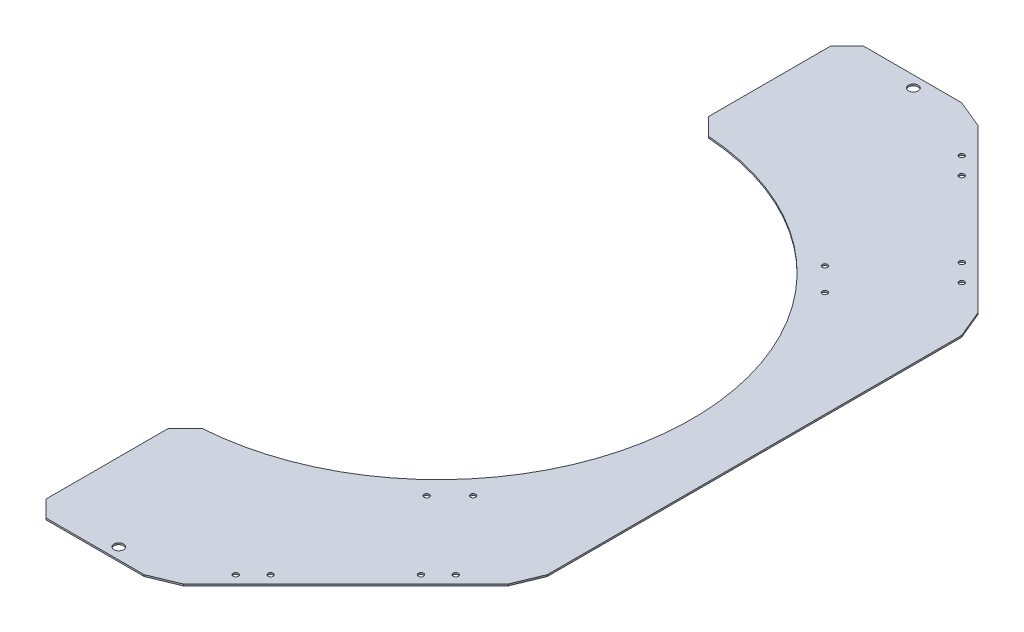
ISO-10303-21;
HEADER;
FILE_DESCRIPTION(('STEP AP214'),'2;1');
FILE_NAME('part.step','',(''),(''),'','','');
FILE_SCHEMA(('AUTOMOTIVE_DESIGN { 1 0 10303 214 1 1 1 1 }'));
ENDSEC;
DATA;
#1=APPLICATION_CONTEXT('core data for automotive mechanical design processes');
#2=APPLICATION_PROTOCOL_DEFINITION('international standard','automotive_design',2000,#1);
#3=PRODUCT_CONTEXT('',#1,'mechanical');
#4=PRODUCT('Part','Part','',(#3));
#5=PRODUCT_RELATED_PRODUCT_CATEGORY('part','',(#4));
#6=PRODUCT_DEFINITION_FORMATION('','',#4);
#7=PRODUCT_DEFINITION_CONTEXT('part definition',#1,'design');
#8=PRODUCT_DEFINITION('design','',#6,#7);
#9=PRODUCT_DEFINITION_SHAPE('','',#8);
#10=(LENGTH_UNIT() NAMED_UNIT(*) SI_UNIT(.MILLI.,.METRE.));
#11=(NAMED_UNIT(*) PLANE_ANGLE_UNIT() SI_UNIT($,.RADIAN.));
#12=(NAMED_UNIT(*) SI_UNIT($,.STERADIAN.) SOLID_ANGLE_UNIT());
#13=UNCERTAINTY_MEASURE_WITH_UNIT(LENGTH_MEASURE(1.E-05),#10,'distance_accuracy_value','');
#14=(GEOMETRIC_REPRESENTATION_CONTEXT(3) GLOBAL_UNCERTAINTY_ASSIGNED_CONTEXT((#13)) GLOBAL_UNIT_ASSIGNED_CONTEXT((#10,
#11,#12)) REPRESENTATION_CONTEXT('',''));
#15=CARTESIAN_POINT('',(0.,0.,0.));
#16=DIRECTION('',(0.,0.,1.));
#17=DIRECTION('',(1.,0.,0.));
#18=AXIS2_PLACEMENT_3D('',#15,#16,#17);
#19=CARTESIAN_POINT('',(0.,1.,0.));
#20=DIRECTION('',(0.,-1.,0.));
#21=DIRECTION('',(0.,0.,-1.));
#22=AXIS2_PLACEMENT_3D('',#19,#20,#21);
#23=CYLINDRICAL_SURFACE('',#22,155.);
#24=CARTESIAN_POINT('',(0.,0.,0.));
#25=DIRECTION('',(0.,1.,0.));
#26=DIRECTION('',(0.,0.,1.));
#27=AXIS2_PLACEMENT_3D('',#24,#25,#26);
#28=CIRCLE('',#27,155.);
#29=CARTESIAN_POINT('',(10.345651551691,0.,154.654348448309));
#30=VERTEX_POINT('',#29);
#31=CARTESIAN_POINT('',(10.3456515516909,0.,-154.654348448309));
#32=VERTEX_POINT('',#31);
#33=EDGE_CURVE('E203',#30,#32,#28,.T.);
#34=ORIENTED_EDGE('',*,*,#33,.F.);
#35=DIRECTION('',(0.,-1.,0.));
#36=VECTOR('',#35,1.);
#37=CARTESIAN_POINT('',(10.345651551691,1.,154.654348448309));
#38=LINE('',#37,#36);
#39=CARTESIAN_POINT('',(10.345651551691,1.,154.654348448309));
#40=VERTEX_POINT('',#39);
#41=EDGE_CURVE('E269',#30,#40,#38,.F.);
#42=ORIENTED_EDGE('',*,*,#41,.T.);
#43=CARTESIAN_POINT('',(0.,1.,0.));
#44=DIRECTION('',(0.,1.,0.));
#45=DIRECTION('',(0.,0.,1.));
#46=AXIS2_PLACEMENT_3D('',#43,#44,#45);
#47=CIRCLE('',#46,155.);
#48=CARTESIAN_POINT('',(10.3456515516909,1.,-154.654348448309));
#49=VERTEX_POINT('',#48);
#50=EDGE_CURVE('E221',#40,#49,#47,.T.);
#51=ORIENTED_EDGE('',*,*,#50,.T.);
#52=DIRECTION('',(0.,-1.,0.));
#53=VECTOR('',#52,1.);
#54=CARTESIAN_POINT('',(10.3456515516909,1.,-154.654348448309));
#55=LINE('',#54,#53);
#56=EDGE_CURVE('E263',#49,#32,#55,.T.);
#57=ORIENTED_EDGE('',*,*,#56,.T.);
#58=EDGE_LOOP('',(#34,#42,#51,#57));
#59=FACE_BOUND('',#58,.T.);
#60=ADVANCED_FACE('F43',(#59),#23,.F.);
#61=CARTESIAN_POINT('',(0.,1.,0.));
#62=DIRECTION('',(-1.,0.,0.));
#63=DIRECTION('',(0.,0.,1.));
#64=AXIS2_PLACEMENT_3D('',#61,#62,#63);
#65=PLANE('',#64);
#66=DIRECTION('',(0.,0.,-1.));
#67=VECTOR('',#66,1.);
#68=CARTESIAN_POINT('',(0.,1.,0.));
#69=LINE('',#68,#67);
#70=CARTESIAN_POINT('',(0.,1.,239.705627484771));
#71=VERTEX_POINT('',#70);
#72=CARTESIAN_POINT('',(0.,1.,165.));
#73=VERTEX_POINT('',#72);
#74=EDGE_CURVE('E194',#71,#73,#69,.T.);
#75=ORIENTED_EDGE('',*,*,#74,.T.);
#76=DIRECTION('',(0.,-1.,0.));
#77=VECTOR('',#76,1.);
#78=CARTESIAN_POINT('',(0.,1.,165.));
#79=LINE('',#78,#77);
#80=CARTESIAN_POINT('',(0.,0.,165.));
#81=VERTEX_POINT('',#80);
#82=EDGE_CURVE('E259',#73,#81,#79,.T.);
#83=ORIENTED_EDGE('',*,*,#82,.T.);
#84=DIRECTION('',(0.,0.,-1.));
#85=VECTOR('',#84,1.);
#86=CARTESIAN_POINT('',(0.,0.,0.));
#87=LINE('',#86,#85);
#88=CARTESIAN_POINT('',(0.,0.,239.705627484771));
#89=VERTEX_POINT('',#88);
#90=EDGE_CURVE('E210',#89,#81,#87,.T.);
#91=ORIENTED_EDGE('',*,*,#90,.F.);
#92=DIRECTION('',(0.,1.,0.));
#93=VECTOR('',#92,1.);
#94=CARTESIAN_POINT('',(0.,1.,239.705627484771));
#95=LINE('',#94,#93);
#96=EDGE_CURVE('E257',#89,#71,#95,.T.);
#97=ORIENTED_EDGE('',*,*,#96,.T.);
#98=EDGE_LOOP('',(#75,#83,#91,#97));
#99=FACE_BOUND('',#98,.T.);
#100=ADVANCED_FACE('F364',(#99),#65,.T.);
#101=CARTESIAN_POINT('',(0.,1.,249.705627484771));
#102=DIRECTION('',(0.,0.,1.));
#103=DIRECTION('',(1.,0.,0.));
#104=AXIS2_PLACEMENT_3D('',#101,#102,#103);
#105=PLANE('',#104);
#106=DIRECTION('',(-1.,0.,0.));
#107=VECTOR('',#106,1.);
#108=CARTESIAN_POINT('',(0.,0.,249.705627484771));
#109=LINE('',#108,#107);
#110=CARTESIAN_POINT('',(70.,0.,249.705627484771));
#111=VERTEX_POINT('',#110);
#112=CARTESIAN_POINT('',(9.99999999999995,0.,249.705627484771));
#113=VERTEX_POINT('',#112);
#114=EDGE_CURVE('E211',#111,#113,#109,.T.);
#115=ORIENTED_EDGE('',*,*,#114,.F.);
#116=DIRECTION('',(0.,1.,0.));
#117=VECTOR('',#116,1.);
#118=CARTESIAN_POINT('',(70.,1.,249.705627484771));
#119=LINE('',#118,#117);
#120=CARTESIAN_POINT('',(70.,1.,249.705627484771));
#121=VERTEX_POINT('',#120);
#122=EDGE_CURVE('E256',#111,#121,#119,.T.);
#123=ORIENTED_EDGE('',*,*,#122,.T.);
#124=DIRECTION('',(-1.,0.,0.));
#125=VECTOR('',#124,1.);
#126=CARTESIAN_POINT('',(0.,1.,249.705627484771));
#127=LINE('',#126,#125);
#128=CARTESIAN_POINT('',(9.99999999999995,1.,249.705627484771));
#129=VERTEX_POINT('',#128);
#130=EDGE_CURVE('E186',#121,#129,#127,.T.);
#131=ORIENTED_EDGE('',*,*,#130,.T.);
#132=DIRECTION('',(0.,-1.,0.));
#133=VECTOR('',#132,1.);
#134=CARTESIAN_POINT('',(9.99999999999995,1.,249.705627484771));
#135=LINE('',#134,#133);
#136=EDGE_CURVE('E254',#129,#113,#135,.T.);
#137=ORIENTED_EDGE('',*,*,#136,.T.);
#138=EDGE_LOOP('',(#115,#123,#131,#137));
#139=FACE_BOUND('',#138,.T.);
#140=ADVANCED_FACE('F425',(#139),#105,.T.);
#141=CARTESIAN_POINT('',(164.852813742386,1.,164.852813742386));
#142=DIRECTION('',(0.707106781186548,0.,0.707106781186547));
#143=DIRECTION('',(0.707106781186547,0.,-0.707106781186548));
#144=AXIS2_PLACEMENT_3D('',#141,#142,#143);
#145=PLANE('',#144);
#146=DIRECTION('',(-0.707106781186547,0.,0.707106781186548));
#147=VECTOR('',#146,1.);
#148=CARTESIAN_POINT('',(164.852813742386,0.,164.852813742386));
#149=LINE('',#148,#147);
#150=CARTESIAN_POINT('',(186.066017177982,0.,143.639610306789));
#151=VERTEX_POINT('',#150);
#152=CARTESIAN_POINT('',(87.0710678118655,0.,242.634559672906));
#153=VERTEX_POINT('',#152);
#154=EDGE_CURVE('E181',#151,#153,#149,.T.);
#155=ORIENTED_EDGE('',*,*,#154,.F.);
#156=DIRECTION('',(0.,1.,0.));
#157=VECTOR('',#156,1.);
#158=CARTESIAN_POINT('',(186.066017177982,1.,143.639610306789));
#159=LINE('',#158,#157);
#160=CARTESIAN_POINT('',(186.066017177982,1.,143.639610306789));
#161=VERTEX_POINT('',#160);
#162=EDGE_CURVE('E165',#151,#161,#159,.T.);
#163=ORIENTED_EDGE('',*,*,#162,.T.);
#164=DIRECTION('',(-0.707106781186547,0.,0.707106781186548));
#165=VECTOR('',#164,1.);
#166=CARTESIAN_POINT('',(164.852813742386,1.,164.852813742386));
#167=LINE('',#166,#165);
#168=CARTESIAN_POINT('',(87.0710678118655,1.,242.634559672906));
#169=VERTEX_POINT('',#168);
#170=EDGE_CURVE('E178',#161,#169,#167,.T.);
#171=ORIENTED_EDGE('',*,*,#170,.T.);
#172=DIRECTION('',(0.,-1.,0.));
#173=VECTOR('',#172,1.);
#174=CARTESIAN_POINT('',(87.0710678118655,1.,242.634559672906));
#175=LINE('',#174,#173);
#176=EDGE_CURVE('E182',#169,#153,#175,.T.);
#177=ORIENTED_EDGE('',*,*,#176,.T.);
#178=EDGE_LOOP('',(#155,#163,#171,#177));
#179=FACE_BOUND('',#178,.T.);
#180=ADVANCED_FACE('F176',(#179),#145,.T.);
#181=CARTESIAN_POINT('',(164.852813742386,1.,-164.852813742386));
#182=DIRECTION('',(0.707106781186547,0.,-0.707106781186547));
#183=DIRECTION('',(-0.707106781186548,0.,-0.707106781186548));
#184=AXIS2_PLACEMENT_3D('',#181,#182,#183);
#185=PLANE('',#184);
#186=DIRECTION('',(0.707106781186548,0.,0.707106781186548));
#187=VECTOR('',#186,1.);
#188=CARTESIAN_POINT('',(164.852813742386,0.,-164.852813742386));
#189=LINE('',#188,#187);
#190=CARTESIAN_POINT('',(87.0710678118655,0.,-242.634559672906));
#191=VERTEX_POINT('',#190);
#192=CARTESIAN_POINT('',(186.066017177982,0.,-143.639610306789));
#193=VERTEX_POINT('',#192);
#194=EDGE_CURVE('E214',#191,#193,#189,.T.);
#195=ORIENTED_EDGE('',*,*,#194,.F.);
#196=DIRECTION('',(0.,1.,0.));
#197=VECTOR('',#196,1.);
#198=CARTESIAN_POINT('',(87.0710678118655,1.,-242.634559672906));
#199=LINE('',#198,#197);
#200=CARTESIAN_POINT('',(87.0710678118655,1.,-242.634559672906));
#201=VERTEX_POINT('',#200);
#202=EDGE_CURVE('E11',#191,#201,#199,.T.);
#203=ORIENTED_EDGE('',*,*,#202,.T.);
#204=DIRECTION('',(0.707106781186548,0.,0.707106781186548));
#205=VECTOR('',#204,1.);
#206=CARTESIAN_POINT('',(164.852813742386,1.,-164.852813742386));
#207=LINE('',#206,#205);
#208=CARTESIAN_POINT('',(186.066017177982,1.,-143.639610306789));
#209=VERTEX_POINT('',#208);
#210=EDGE_CURVE('E189',#201,#209,#207,.T.);
#211=ORIENTED_EDGE('',*,*,#210,.T.);
#212=DIRECTION('',(0.,-1.,0.));
#213=VECTOR('',#212,1.);
#214=CARTESIAN_POINT('',(186.066017177982,0.,-143.639610306789));
#215=LINE('',#214,#213);
#216=EDGE_CURVE('E52',#209,#193,#215,.T.);
#217=ORIENTED_EDGE('',*,*,#216,.T.);
#218=EDGE_LOOP('',(#195,#203,#211,#217));
#219=FACE_BOUND('',#218,.T.);
#220=ADVANCED_FACE('F398',(#219),#185,.T.);
#221=CARTESIAN_POINT('',(0.,1.,-249.705627484771));
#222=DIRECTION('',(0.,0.,-1.));
#223=DIRECTION('',(-1.,0.,0.));
#224=AXIS2_PLACEMENT_3D('',#221,#222,#223);
#225=PLANE('',#224);
#226=DIRECTION('',(1.,0.,0.));
#227=VECTOR('',#226,1.);
#228=CARTESIAN_POINT('',(0.,0.,-249.705627484771));
#229=LINE('',#228,#227);
#230=CARTESIAN_POINT('',(10.0000000000001,0.,-249.705627484771));
#231=VERTEX_POINT('',#230);
#232=CARTESIAN_POINT('',(69.9999999999999,0.,-249.705627484771));
#233=VERTEX_POINT('',#232);
#234=EDGE_CURVE('E218',#231,#233,#229,.T.);
#235=ORIENTED_EDGE('',*,*,#234,.F.);
#236=DIRECTION('',(0.,1.,0.));
#237=VECTOR('',#236,1.);
#238=CARTESIAN_POINT('',(10.0000000000001,1.,-249.705627484771));
#239=LINE('',#238,#237);
#240=CARTESIAN_POINT('',(10.0000000000001,1.,-249.705627484771));
#241=VERTEX_POINT('',#240);
#242=EDGE_CURVE('E273',#231,#241,#239,.T.);
#243=ORIENTED_EDGE('',*,*,#242,.T.);
#244=DIRECTION('',(1.,0.,0.));
#245=VECTOR('',#244,1.);
#246=CARTESIAN_POINT('',(0.,1.,-249.705627484771));
#247=LINE('',#246,#245);
#248=CARTESIAN_POINT('',(69.9999999999999,1.,-249.705627484771));
#249=VERTEX_POINT('',#248);
#250=EDGE_CURVE('E195',#241,#249,#247,.T.);
#251=ORIENTED_EDGE('',*,*,#250,.T.);
#252=DIRECTION('',(0.,-1.,0.));
#253=VECTOR('',#252,1.);
#254=CARTESIAN_POINT('',(69.9999999999999,1.,-249.705627484771));
#255=LINE('',#254,#253);
#256=EDGE_CURVE('E271',#249,#233,#255,.T.);
#257=ORIENTED_EDGE('',*,*,#256,.T.);
#258=EDGE_LOOP('',(#235,#243,#251,#257));
#259=FACE_BOUND('',#258,.T.);
#260=ADVANCED_FACE('F395',(#259),#225,.T.);
#261=CARTESIAN_POINT('',(0.,1.,0.));
#262=DIRECTION('',(-1.,0.,0.));
#263=DIRECTION('',(0.,0.,1.));
#264=AXIS2_PLACEMENT_3D('',#261,#262,#263);
#265=PLANE('',#264);
#266=DIRECTION('',(0.,0.,-1.));
#267=VECTOR('',#266,1.);
#268=CARTESIAN_POINT('',(0.,0.,0.));
#269=LINE('',#268,#267);
#270=CARTESIAN_POINT('',(0.,0.,-165.));
#271=VERTEX_POINT('',#270);
#272=CARTESIAN_POINT('',(0.,0.,-239.705627484771));
#273=VERTEX_POINT('',#272);
#274=EDGE_CURVE('E216',#271,#273,#269,.T.);
#275=ORIENTED_EDGE('',*,*,#274,.F.);
#276=DIRECTION('',(0.,1.,0.));
#277=VECTOR('',#276,1.);
#278=CARTESIAN_POINT('',(0.,1.,-165.));
#279=LINE('',#278,#277);
#280=CARTESIAN_POINT('',(0.,1.,-165.));
#281=VERTEX_POINT('',#280);
#282=EDGE_CURVE('E272',#271,#281,#279,.T.);
#283=ORIENTED_EDGE('',*,*,#282,.T.);
#284=DIRECTION('',(0.,0.,-1.));
#285=VECTOR('',#284,1.);
#286=CARTESIAN_POINT('',(0.,1.,0.));
#287=LINE('',#286,#285);
#288=CARTESIAN_POINT('',(0.,1.,-239.705627484771));
#289=VERTEX_POINT('',#288);
#290=EDGE_CURVE('E204',#281,#289,#287,.T.);
#291=ORIENTED_EDGE('',*,*,#290,.T.);
#292=DIRECTION('',(0.,-1.,0.));
#293=VECTOR('',#292,1.);
#294=CARTESIAN_POINT('',(0.,1.,-239.705627484771));
#295=LINE('',#294,#293);
#296=EDGE_CURVE('E270',#289,#273,#295,.T.);
#297=ORIENTED_EDGE('',*,*,#296,.T.);
#298=EDGE_LOOP('',(#275,#283,#291,#297));
#299=FACE_BOUND('',#298,.T.);
#300=ADVANCED_FACE('F384',(#299),#265,.T.);
#301=CARTESIAN_POINT('',(0.,1.,0.));
#302=DIRECTION('',(0.,1.,0.));
#303=DIRECTION('',(0.,0.,1.));
#304=AXIS2_PLACEMENT_3D('',#301,#302,#303);
#305=PLANE('',#304);
#306=CARTESIAN_POINT('',(114.557611844575,1.,-121.62867965644));
#307=DIRECTION('',(0.,1.,0.));
#308=DIRECTION('',(0.,0.,1.));
#309=AXIS2_PLACEMENT_3D('',#306,#307,#308);
#310=CIRCLE('',#309,1.60000000000001);
#311=CARTESIAN_POINT('',(114.557611844575,1.,-120.02867965644));
#312=VERTEX_POINT('',#311);
#313=EDGE_CURVE('E317',#312,#312,#310,.T.);
#314=ORIENTED_EDGE('',*,*,#313,.F.);
#315=EDGE_LOOP('',(#314));
#316=FACE_BOUND('',#315,.T.);
#317=CARTESIAN_POINT('',(128.699747468306,1.,-107.48654403271));
#318=DIRECTION('',(0.,1.,0.));
#319=DIRECTION('',(0.,0.,1.));
#320=AXIS2_PLACEMENT_3D('',#317,#318,#319);
#321=CIRCLE('',#320,1.59999999999999);
#322=CARTESIAN_POINT('',(128.699747468306,1.,-105.88654403271));
#323=VERTEX_POINT('',#322);
#324=EDGE_CURVE('E492',#323,#323,#321,.T.);
#325=ORIENTED_EDGE('',*,*,#324,.F.);
#326=EDGE_LOOP('',(#325));
#327=FACE_BOUND('',#326,.T.);
#328=CARTESIAN_POINT('',(128.699747468306,1.,107.48654403271));
#329=DIRECTION('',(0.,1.,0.));
#330=DIRECTION('',(0.,0.,-1.));
#331=AXIS2_PLACEMENT_3D('',#328,#329,#330);
#332=CIRCLE('',#331,1.59999999999999);
#333=CARTESIAN_POINT('',(128.699747468306,1.,105.88654403271));
#334=VERTEX_POINT('',#333);
#335=EDGE_CURVE('E497',#334,#334,#332,.T.);
#336=ORIENTED_EDGE('',*,*,#335,.F.);
#337=EDGE_LOOP('',(#336));
#338=FACE_BOUND('',#337,.T.);
#339=CARTESIAN_POINT('',(114.557611844575,1.,121.62867965644));
#340=DIRECTION('',(0.,1.,0.));
#341=DIRECTION('',(0.,0.,-1.));
#342=AXIS2_PLACEMENT_3D('',#339,#340,#341);
#343=CIRCLE('',#342,1.60000000000001);
#344=CARTESIAN_POINT('',(114.557611844575,1.,120.02867965644));
#345=VERTEX_POINT('',#344);
#346=EDGE_CURVE('E503',#345,#345,#343,.T.);
#347=ORIENTED_EDGE('',*,*,#346,.F.);
#348=EDGE_LOOP('',(#347));
#349=FACE_BOUND('',#348,.T.);
#350=CARTESIAN_POINT('',(47.4999999999999,1.,-242.75));
#351=DIRECTION('',(0.,1.,0.));
#352=DIRECTION('',(0.,0.,1.));
#353=AXIS2_PLACEMENT_3D('',#350,#351,#352);
#354=CIRCLE('',#353,3.);
#355=CARTESIAN_POINT('',(47.4999999999999,1.,-239.75));
#356=VERTEX_POINT('',#355);
#357=EDGE_CURVE('E308',#356,#356,#354,.T.);
#358=ORIENTED_EDGE('',*,*,#357,.F.);
#359=EDGE_LOOP('',(#358));
#360=FACE_BOUND('',#359,.T.);
#361=CARTESIAN_POINT('',(47.5,1.,242.75));
#362=DIRECTION('',(0.,1.,0.));
#363=DIRECTION('',(0.,0.,1.));
#364=AXIS2_PLACEMENT_3D('',#361,#362,#363);
#365=CIRCLE('',#364,3.);
#366=CARTESIAN_POINT('',(47.5,1.,245.75));
#367=VERTEX_POINT('',#366);
#368=EDGE_CURVE('E322',#367,#367,#365,.T.);
#369=ORIENTED_EDGE('',*,*,#368,.F.);
#370=EDGE_LOOP('',(#369));
#371=FACE_BOUND('',#370,.T.);
#372=CARTESIAN_POINT('',(98.0312229202569,1.,221.774909627903));
#373=DIRECTION('',(0.,1.,0.));
#374=DIRECTION('',(0.,0.,1.));
#375=AXIS2_PLACEMENT_3D('',#372,#373,#374);
#376=CIRCLE('',#375,1.6);
#377=CARTESIAN_POINT('',(98.0312229202569,1.,223.374909627903));
#378=VERTEX_POINT('',#377);
#379=EDGE_CURVE('E285',#378,#378,#376,.T.);
#380=ORIENTED_EDGE('',*,*,#379,.F.);
#381=EDGE_LOOP('',(#380));
#382=FACE_BOUND('',#381,.T.);
#383=CARTESIAN_POINT('',(108.637824638055,1.,211.168307910105));
#384=DIRECTION('',(0.,1.,0.));
#385=DIRECTION('',(0.,0.,1.));
#386=AXIS2_PLACEMENT_3D('',#383,#384,#385);
#387=CIRCLE('',#386,1.6);
#388=CARTESIAN_POINT('',(108.637824638055,1.,212.768307910105));
#389=VERTEX_POINT('',#388);
#390=EDGE_CURVE('E337',#389,#389,#387,.T.);
#391=ORIENTED_EDGE('',*,*,#390,.F.);
#392=EDGE_LOOP('',(#391));
#393=FACE_BOUND('',#392,.T.);
#394=CARTESIAN_POINT('',(154.599765415181,1.,165.206367132979));
#395=DIRECTION('',(0.,1.,0.));
#396=DIRECTION('',(0.,0.,-1.));
#397=AXIS2_PLACEMENT_3D('',#394,#395,#396);
#398=CIRCLE('',#397,1.59999999999999);
#399=CARTESIAN_POINT('',(154.599765415181,1.,163.606367132979));
#400=VERTEX_POINT('',#399);
#401=EDGE_CURVE('E339',#400,#400,#398,.T.);
#402=ORIENTED_EDGE('',*,*,#401,.F.);
#403=EDGE_LOOP('',(#402));
#404=FACE_BOUND('',#403,.T.);
#405=CARTESIAN_POINT('',(165.206367132979,1.,154.599765415181));
#406=DIRECTION('',(0.,1.,0.));
#407=DIRECTION('',(0.,0.,-1.));
#408=AXIS2_PLACEMENT_3D('',#405,#406,#407);
#409=CIRCLE('',#408,1.59999999999999);
#410=CARTESIAN_POINT('',(165.206367132979,1.,152.999765415181));
#411=VERTEX_POINT('',#410);
#412=EDGE_CURVE('E345',#411,#411,#409,.T.);
#413=ORIENTED_EDGE('',*,*,#412,.F.);
#414=EDGE_LOOP('',(#413));
#415=FACE_BOUND('',#414,.T.);
#416=CARTESIAN_POINT('',(165.206367132979,1.,-154.599765415181));
#417=DIRECTION('',(0.,1.,0.));
#418=DIRECTION('',(0.,0.,1.));
#419=AXIS2_PLACEMENT_3D('',#416,#417,#418);
#420=CIRCLE('',#419,1.59999999999999);
#421=CARTESIAN_POINT('',(165.206367132979,1.,-152.999765415181));
#422=VERTEX_POINT('',#421);
#423=EDGE_CURVE('E344',#422,#422,#420,.T.);
#424=ORIENTED_EDGE('',*,*,#423,.F.);
#425=EDGE_LOOP('',(#424));
#426=FACE_BOUND('',#425,.T.);
#427=CARTESIAN_POINT('',(154.599765415181,1.,-165.206367132979));
#428=DIRECTION('',(0.,1.,0.));
#429=DIRECTION('',(0.,0.,1.));
#430=AXIS2_PLACEMENT_3D('',#427,#428,#429);
#431=CIRCLE('',#430,1.59999999999999);
#432=CARTESIAN_POINT('',(154.599765415181,1.,-163.606367132979));
#433=VERTEX_POINT('',#432);
#434=EDGE_CURVE('E348',#433,#433,#431,.T.);
#435=ORIENTED_EDGE('',*,*,#434,.F.);
#436=EDGE_LOOP('',(#435));
#437=FACE_BOUND('',#436,.T.);
#438=CARTESIAN_POINT('',(108.637824638055,1.,-211.168307910105));
#439=DIRECTION('',(0.,1.,0.));
#440=DIRECTION('',(0.,0.,-1.));
#441=AXIS2_PLACEMENT_3D('',#438,#439,#440);
#442=CIRCLE('',#441,1.6);
#443=CARTESIAN_POINT('',(108.637824638055,1.,-212.768307910105));
#444=VERTEX_POINT('',#443);
#445=EDGE_CURVE('E354',#444,#444,#442,.T.);
#446=ORIENTED_EDGE('',*,*,#445,.F.);
#447=EDGE_LOOP('',(#446));
#448=FACE_BOUND('',#447,.T.);
#449=CARTESIAN_POINT('',(98.0312229202569,1.,-221.774909627903));
#450=DIRECTION('',(0.,1.,0.));
#451=DIRECTION('',(0.,0.,-1.));
#452=AXIS2_PLACEMENT_3D('',#449,#450,#451);
#453=CIRCLE('',#452,1.6);
#454=CARTESIAN_POINT('',(98.0312229202569,1.,-223.374909627903));
#455=VERTEX_POINT('',#454);
#456=EDGE_CURVE('E311',#455,#455,#453,.T.);
#457=ORIENTED_EDGE('',*,*,#456,.F.);
#458=EDGE_LOOP('',(#457));
#459=FACE_BOUND('',#458,.T.);
#460=ORIENTED_EDGE('',*,*,#170,.F.);
#461=DIRECTION('',(0.38268343236509,0.,-0.923879532511287));
#462=VECTOR('',#461,1.);
#463=CARTESIAN_POINT('',(209.601551083915,1.,86.8198051533945));
#464=LINE('',#463,#462);
#465=CARTESIAN_POINT('',(193.137084989848,1.,126.568542494924));
#466=VERTEX_POINT('',#465);
#467=EDGE_CURVE('E157',#161,#466,#464,.T.);
#468=ORIENTED_EDGE('',*,*,#467,.T.);
#469=DIRECTION('',(0.,0.,1.));
#470=VECTOR('',#469,1.);
#471=CARTESIAN_POINT('',(193.137084989848,1.,-136.568542494924));
#472=LINE('',#471,#470);
#473=CARTESIAN_POINT('',(193.137084989848,1.,-126.568542494924));
#474=VERTEX_POINT('',#473);
#475=EDGE_CURVE('E303',#474,#466,#472,.T.);
#476=ORIENTED_EDGE('',*,*,#475,.F.);
#477=DIRECTION('',(-0.38268343236509,0.,-0.923879532511287));
#478=VECTOR('',#477,1.);
#479=CARTESIAN_POINT('',(209.601551083915,1.,-86.8198051533946));
#480=LINE('',#479,#478);
#481=EDGE_CURVE('E222',#474,#209,#480,.T.);
#482=ORIENTED_EDGE('',*,*,#481,.T.);
#483=ORIENTED_EDGE('',*,*,#210,.F.);
#484=DIRECTION('',(0.923879532511287,0.,0.38268343236509));
#485=VECTOR('',#484,1.);
#486=CARTESIAN_POINT('',(98.5355339059328,1.,-237.885822331377));
#487=LINE('',#486,#485);
#488=EDGE_CURVE('E227',#201,#249,#487,.F.);
#489=ORIENTED_EDGE('',*,*,#488,.T.);
#490=ORIENTED_EDGE('',*,*,#250,.F.);
#491=DIRECTION('',(0.707106781186548,0.,-0.707106781186548));
#492=VECTOR('',#491,1.);
#493=CARTESIAN_POINT('',(-119.852813742386,1.,-119.852813742386));
#494=LINE('',#493,#492);
#495=EDGE_CURVE('E230',#241,#289,#494,.F.);
#496=ORIENTED_EDGE('',*,*,#495,.T.);
#497=ORIENTED_EDGE('',*,*,#290,.F.);
#498=DIRECTION('',(-0.707106781186547,0.,-0.707106781186548));
#499=VECTOR('',#498,1.);
#500=CARTESIAN_POINT('',(82.5,1.,-82.4999999999999));
#501=LINE('',#500,#499);
#502=EDGE_CURVE('E233',#281,#49,#501,.F.);
#503=ORIENTED_EDGE('',*,*,#502,.T.);
#504=ORIENTED_EDGE('',*,*,#50,.F.);
#505=DIRECTION('',(0.707106781186545,0.,-0.70710678118655));
#506=VECTOR('',#505,1.);
#507=CARTESIAN_POINT('',(82.5,1.,82.4999999999995));
#508=LINE('',#507,#506);
#509=EDGE_CURVE('E231',#40,#73,#508,.F.);
#510=ORIENTED_EDGE('',*,*,#509,.T.);
#511=ORIENTED_EDGE('',*,*,#74,.F.);
#512=DIRECTION('',(-0.707106781186546,0.,-0.707106781186549));
#513=VECTOR('',#512,1.);
#514=CARTESIAN_POINT('',(-119.852813742386,1.,119.852813742385));
#515=LINE('',#514,#513);
#516=EDGE_CURVE('E185',#71,#129,#515,.F.);
#517=ORIENTED_EDGE('',*,*,#516,.T.);
#518=ORIENTED_EDGE('',*,*,#130,.F.);
#519=DIRECTION('',(-0.923879532511287,0.,0.38268343236509));
#520=VECTOR('',#519,1.);
#521=CARTESIAN_POINT('',(98.5355339059329,1.,237.885822331377));
#522=LINE('',#521,#520);
#523=EDGE_CURVE('E171',#121,#169,#522,.F.);
#524=ORIENTED_EDGE('',*,*,#523,.T.);
#525=EDGE_LOOP('',(#460,#468,#476,#482,#483,#489,#490,#496,#497,#503,#504,#510,#511,#517,#518,#524));
#526=FACE_BOUND('',#525,.T.);
#527=ADVANCED_FACE('F184',(#316,#327,#338,#349,#360,#371,#382,#393,#404,#415,#426,#437,#448,
#459,#526),#305,.T.);
#528=CARTESIAN_POINT('',(0.,0.,0.));
#529=DIRECTION('',(0.,1.,0.));
#530=DIRECTION('',(0.,0.,1.));
#531=AXIS2_PLACEMENT_3D('',#528,#529,#530);
#532=PLANE('',#531);
#533=CARTESIAN_POINT('',(114.557611844575,0.,-121.62867965644));
#534=DIRECTION('',(0.,1.,0.));
#535=DIRECTION('',(0.,0.,1.));
#536=AXIS2_PLACEMENT_3D('',#533,#534,#535);
#537=CIRCLE('',#536,1.60000000000001);
#538=CARTESIAN_POINT('',(114.557611844575,0.,-120.02867965644));
#539=VERTEX_POINT('',#538);
#540=EDGE_CURVE('E48',#539,#539,#537,.T.);
#541=ORIENTED_EDGE('',*,*,#540,.T.);
#542=EDGE_LOOP('',(#541));
#543=FACE_BOUND('',#542,.T.);
#544=CARTESIAN_POINT('',(128.699747468306,0.,-107.48654403271));
#545=DIRECTION('',(0.,1.,0.));
#546=DIRECTION('',(0.,0.,1.));
#547=AXIS2_PLACEMENT_3D('',#544,#545,#546);
#548=CIRCLE('',#547,1.59999999999999);
#549=CARTESIAN_POINT('',(128.699747468306,0.,-105.88654403271));
#550=VERTEX_POINT('',#549);
#551=EDGE_CURVE('E319',#550,#550,#548,.T.);
#552=ORIENTED_EDGE('',*,*,#551,.T.);
#553=EDGE_LOOP('',(#552));
#554=FACE_BOUND('',#553,.T.);
#555=CARTESIAN_POINT('',(128.699747468306,0.,107.48654403271));
#556=DIRECTION('',(0.,1.,0.));
#557=DIRECTION('',(0.,0.,1.));
#558=AXIS2_PLACEMENT_3D('',#555,#556,#557);
#559=CIRCLE('',#558,1.59999999999999);
#560=CARTESIAN_POINT('',(128.699747468306,0.,109.086544032709));
#561=VERTEX_POINT('',#560);
#562=EDGE_CURVE('E314',#561,#561,#559,.T.);
#563=ORIENTED_EDGE('',*,*,#562,.T.);
#564=EDGE_LOOP('',(#563));
#565=FACE_BOUND('',#564,.T.);
#566=CARTESIAN_POINT('',(114.557611844575,0.,121.62867965644));
#567=DIRECTION('',(0.,1.,0.));
#568=DIRECTION('',(0.,0.,1.));
#569=AXIS2_PLACEMENT_3D('',#566,#567,#568);
#570=CIRCLE('',#569,1.60000000000001);
#571=CARTESIAN_POINT('',(114.557611844575,0.,123.22867965644));
#572=VERTEX_POINT('',#571);
#573=EDGE_CURVE('E315',#572,#572,#570,.T.);
#574=ORIENTED_EDGE('',*,*,#573,.T.);
#575=EDGE_LOOP('',(#574));
#576=FACE_BOUND('',#575,.T.);
#577=CARTESIAN_POINT('',(47.4999999999999,0.,-242.75));
#578=DIRECTION('',(0.,1.,0.));
#579=DIRECTION('',(0.,0.,1.));
#580=AXIS2_PLACEMENT_3D('',#577,#578,#579);
#581=CIRCLE('',#580,3.);
#582=CARTESIAN_POINT('',(47.4999999999999,0.,-239.75));
#583=VERTEX_POINT('',#582);
#584=EDGE_CURVE('E310',#583,#583,#581,.T.);
#585=ORIENTED_EDGE('',*,*,#584,.T.);
#586=EDGE_LOOP('',(#585));
#587=FACE_BOUND('',#586,.T.);
#588=CARTESIAN_POINT('',(47.5,0.,242.75));
#589=DIRECTION('',(0.,1.,0.));
#590=DIRECTION('',(0.,0.,1.));
#591=AXIS2_PLACEMENT_3D('',#588,#589,#590);
#592=CIRCLE('',#591,3.);
#593=CARTESIAN_POINT('',(47.5,0.,245.75));
#594=VERTEX_POINT('',#593);
#595=EDGE_CURVE('E302',#594,#594,#592,.T.);
#596=ORIENTED_EDGE('',*,*,#595,.T.);
#597=EDGE_LOOP('',(#596));
#598=FACE_BOUND('',#597,.T.);
#599=CARTESIAN_POINT('',(98.0312229202569,0.,221.774909627903));
#600=DIRECTION('',(0.,1.,0.));
#601=DIRECTION('',(0.,0.,1.));
#602=AXIS2_PLACEMENT_3D('',#599,#600,#601);
#603=CIRCLE('',#602,1.6);
#604=CARTESIAN_POINT('',(98.0312229202569,0.,223.374909627903));
#605=VERTEX_POINT('',#604);
#606=EDGE_CURVE('E297',#605,#605,#603,.T.);
#607=ORIENTED_EDGE('',*,*,#606,.T.);
#608=EDGE_LOOP('',(#607));
#609=FACE_BOUND('',#608,.T.);
#610=CARTESIAN_POINT('',(108.637824638055,0.,211.168307910105));
#611=DIRECTION('',(0.,1.,0.));
#612=DIRECTION('',(0.,0.,1.));
#613=AXIS2_PLACEMENT_3D('',#610,#611,#612);
#614=CIRCLE('',#613,1.6);
#615=CARTESIAN_POINT('',(108.637824638055,0.,212.768307910105));
#616=VERTEX_POINT('',#615);
#617=EDGE_CURVE('E300',#616,#616,#614,.T.);
#618=ORIENTED_EDGE('',*,*,#617,.T.);
#619=EDGE_LOOP('',(#618));
#620=FACE_BOUND('',#619,.T.);
#621=CARTESIAN_POINT('',(154.599765415181,0.,165.206367132979));
#622=DIRECTION('',(0.,1.,0.));
#623=DIRECTION('',(0.,0.,1.));
#624=AXIS2_PLACEMENT_3D('',#621,#622,#623);
#625=CIRCLE('',#624,1.59999999999999);
#626=CARTESIAN_POINT('',(154.599765415181,0.,166.806367132979));
#627=VERTEX_POINT('',#626);
#628=EDGE_CURVE('E295',#627,#627,#625,.T.);
#629=ORIENTED_EDGE('',*,*,#628,.T.);
#630=EDGE_LOOP('',(#629));
#631=FACE_BOUND('',#630,.T.);
#632=CARTESIAN_POINT('',(165.206367132979,0.,154.599765415181));
#633=DIRECTION('',(0.,1.,0.));
#634=DIRECTION('',(0.,0.,1.));
#635=AXIS2_PLACEMENT_3D('',#632,#633,#634);
#636=CIRCLE('',#635,1.59999999999999);
#637=CARTESIAN_POINT('',(165.206367132979,0.,156.199765415181));
#638=VERTEX_POINT('',#637);
#639=EDGE_CURVE('E293',#638,#638,#636,.T.);
#640=ORIENTED_EDGE('',*,*,#639,.T.);
#641=EDGE_LOOP('',(#640));
#642=FACE_BOUND('',#641,.T.);
#643=CARTESIAN_POINT('',(165.206367132979,0.,-154.599765415181));
#644=DIRECTION('',(0.,1.,0.));
#645=DIRECTION('',(0.,0.,1.));
#646=AXIS2_PLACEMENT_3D('',#643,#644,#645);
#647=CIRCLE('',#646,1.59999999999999);
#648=CARTESIAN_POINT('',(165.206367132979,0.,-152.999765415181));
#649=VERTEX_POINT('',#648);
#650=EDGE_CURVE('E290',#649,#649,#647,.T.);
#651=ORIENTED_EDGE('',*,*,#650,.T.);
#652=EDGE_LOOP('',(#651));
#653=FACE_BOUND('',#652,.T.);
#654=CARTESIAN_POINT('',(154.599765415181,0.,-165.206367132979));
#655=DIRECTION('',(0.,1.,0.));
#656=DIRECTION('',(0.,0.,1.));
#657=AXIS2_PLACEMENT_3D('',#654,#655,#656);
#658=CIRCLE('',#657,1.59999999999999);
#659=CARTESIAN_POINT('',(154.599765415181,0.,-163.606367132979));
#660=VERTEX_POINT('',#659);
#661=EDGE_CURVE('E281',#660,#660,#658,.T.);
#662=ORIENTED_EDGE('',*,*,#661,.T.);
#663=EDGE_LOOP('',(#662));
#664=FACE_BOUND('',#663,.T.);
#665=CARTESIAN_POINT('',(108.637824638055,0.,-211.168307910105));
#666=DIRECTION('',(0.,1.,0.));
#667=DIRECTION('',(0.,0.,1.));
#668=AXIS2_PLACEMENT_3D('',#665,#666,#667);
#669=CIRCLE('',#668,1.6);
#670=CARTESIAN_POINT('',(108.637824638055,0.,-209.568307910105));
#671=VERTEX_POINT('',#670);
#672=EDGE_CURVE('E282',#671,#671,#669,.T.);
#673=ORIENTED_EDGE('',*,*,#672,.T.);
#674=EDGE_LOOP('',(#673));
#675=FACE_BOUND('',#674,.T.);
#676=CARTESIAN_POINT('',(98.0312229202569,0.,-221.774909627903));
#677=DIRECTION('',(0.,1.,0.));
#678=DIRECTION('',(0.,0.,1.));
#679=AXIS2_PLACEMENT_3D('',#676,#677,#678);
#680=CIRCLE('',#679,1.6);
#681=CARTESIAN_POINT('',(98.0312229202569,0.,-220.174909627903));
#682=VERTEX_POINT('',#681);
#683=EDGE_CURVE('E277',#682,#682,#680,.T.);
#684=ORIENTED_EDGE('',*,*,#683,.T.);
#685=EDGE_LOOP('',(#684));
#686=FACE_BOUND('',#685,.T.);
#687=DIRECTION('',(0.,0.,1.));
#688=VECTOR('',#687,1.);
#689=CARTESIAN_POINT('',(193.137084989848,0.,-136.568542494924));
#690=LINE('',#689,#688);
#691=CARTESIAN_POINT('',(193.137084989848,0.,-126.568542494924));
#692=VERTEX_POINT('',#691);
#693=CARTESIAN_POINT('',(193.137084989848,0.,126.568542494924));
#694=VERTEX_POINT('',#693);
#695=EDGE_CURVE('E206',#692,#694,#690,.T.);
#696=ORIENTED_EDGE('',*,*,#695,.T.);
#697=DIRECTION('',(-0.38268343236509,0.,0.923879532511287));
#698=VECTOR('',#697,1.);
#699=CARTESIAN_POINT('',(186.066017177982,0.,143.639610306789));
#700=LINE('',#699,#698);
#701=EDGE_CURVE('E252',#694,#151,#700,.T.);
#702=ORIENTED_EDGE('',*,*,#701,.T.);
#703=ORIENTED_EDGE('',*,*,#154,.T.);
#704=DIRECTION('',(0.923879532511287,0.,-0.38268343236509));
#705=VECTOR('',#704,1.);
#706=CARTESIAN_POINT('',(87.0710678118655,0.,242.634559672906));
#707=LINE('',#706,#705);
#708=EDGE_CURVE('E248',#153,#111,#707,.F.);
#709=ORIENTED_EDGE('',*,*,#708,.T.);
#710=ORIENTED_EDGE('',*,*,#114,.T.);
#711=DIRECTION('',(0.707106781186546,0.,0.707106781186549));
#712=VECTOR('',#711,1.);
#713=CARTESIAN_POINT('',(9.99999999999995,0.,249.705627484771));
#714=LINE('',#713,#712);
#715=EDGE_CURVE('E237',#113,#89,#714,.F.);
#716=ORIENTED_EDGE('',*,*,#715,.T.);
#717=ORIENTED_EDGE('',*,*,#90,.T.);
#718=DIRECTION('',(-0.707106781186545,0.,0.70710678118655));
#719=VECTOR('',#718,1.);
#720=CARTESIAN_POINT('',(0.,0.,165.));
#721=LINE('',#720,#719);
#722=EDGE_CURVE('E250',#81,#30,#721,.F.);
#723=ORIENTED_EDGE('',*,*,#722,.T.);
#724=ORIENTED_EDGE('',*,*,#33,.T.);
#725=DIRECTION('',(0.707106781186547,0.,0.707106781186548));
#726=VECTOR('',#725,1.);
#727=CARTESIAN_POINT('',(10.3456515516909,0.,-154.654348448309));
#728=LINE('',#727,#726);
#729=EDGE_CURVE('E244',#32,#271,#728,.F.);
#730=ORIENTED_EDGE('',*,*,#729,.T.);
#731=ORIENTED_EDGE('',*,*,#274,.T.);
#732=DIRECTION('',(-0.707106781186548,0.,0.707106781186548));
#733=VECTOR('',#732,1.);
#734=CARTESIAN_POINT('',(0.,0.,-239.705627484771));
#735=LINE('',#734,#733);
#736=EDGE_CURVE('E69',#273,#231,#735,.F.);
#737=ORIENTED_EDGE('',*,*,#736,.T.);
#738=ORIENTED_EDGE('',*,*,#234,.T.);
#739=DIRECTION('',(-0.923879532511287,0.,-0.38268343236509));
#740=VECTOR('',#739,1.);
#741=CARTESIAN_POINT('',(69.9999999999999,0.,-249.705627484771));
#742=LINE('',#741,#740);
#743=EDGE_CURVE('E61',#233,#191,#742,.F.);
#744=ORIENTED_EDGE('',*,*,#743,.T.);
#745=ORIENTED_EDGE('',*,*,#194,.T.);
#746=DIRECTION('',(0.38268343236509,0.,0.923879532511287));
#747=VECTOR('',#746,1.);
#748=CARTESIAN_POINT('',(193.137084989848,0.,-126.568542494924));
#749=LINE('',#748,#747);
#750=EDGE_CURVE('E241',#193,#692,#749,.T.);
#751=ORIENTED_EDGE('',*,*,#750,.T.);
#752=EDGE_LOOP('',(#696,#702,#703,#709,#710,#716,#717,#723,#724,#730,#731,#737,#738,#744,#745,#751));
#753=FACE_BOUND('',#752,.T.);
#754=ADVANCED_FACE('F373',(#543,#554,#565,#576,#587,#598,#609,#620,#631,#642,#653,#664,#675,
#686,#753),#532,.F.);
#755=CARTESIAN_POINT('',(193.137084989848,0.,-136.568542494924));
#756=DIRECTION('',(-1.,0.,0.));
#757=DIRECTION('',(0.,0.,1.));
#758=AXIS2_PLACEMENT_3D('',#755,#756,#757);
#759=PLANE('',#758);
#760=ORIENTED_EDGE('',*,*,#475,.T.);
#761=DIRECTION('',(0.,-1.,0.));
#762=VECTOR('',#761,1.);
#763=CARTESIAN_POINT('',(193.137084989848,0.,126.568542494924));
#764=LINE('',#763,#762);
#765=EDGE_CURVE('E164',#466,#694,#764,.T.);
#766=ORIENTED_EDGE('',*,*,#765,.T.);
#767=ORIENTED_EDGE('',*,*,#695,.F.);
#768=DIRECTION('',(0.,1.,0.));
#769=VECTOR('',#768,1.);
#770=CARTESIAN_POINT('',(193.137084989848,1.,-126.568542494924));
#771=LINE('',#770,#769);
#772=EDGE_CURVE('E167',#692,#474,#771,.T.);
#773=ORIENTED_EDGE('',*,*,#772,.T.);
#774=EDGE_LOOP('',(#760,#766,#767,#773));
#775=FACE_BOUND('',#774,.T.);
#776=ADVANCED_FACE('F406',(#775),#759,.F.);
#777=CARTESIAN_POINT('',(186.066017177982,1.,143.639610306789));
#778=DIRECTION('',(0.923879532511287,0.,0.38268343236509));
#779=DIRECTION('',(0.,-1.,0.));
#780=AXIS2_PLACEMENT_3D('',#777,#778,#779);
#781=PLANE('',#780);
#782=ORIENTED_EDGE('',*,*,#701,.F.);
#783=ORIENTED_EDGE('',*,*,#765,.F.);
#784=ORIENTED_EDGE('',*,*,#467,.F.);
#785=ORIENTED_EDGE('',*,*,#162,.F.);
#786=EDGE_LOOP('',(#782,#783,#784,#785));
#787=FACE_BOUND('',#786,.T.);
#788=ADVANCED_FACE('F161',(#787),#781,.T.);
#789=CARTESIAN_POINT('',(87.0710678118655,1.,242.634559672906));
#790=DIRECTION('',(-0.38268343236509,0.,-0.923879532511287));
#791=DIRECTION('',(0.,-1.,0.));
#792=AXIS2_PLACEMENT_3D('',#789,#790,#791);
#793=PLANE('',#792);
#794=ORIENTED_EDGE('',*,*,#523,.F.);
#795=ORIENTED_EDGE('',*,*,#122,.F.);
#796=ORIENTED_EDGE('',*,*,#708,.F.);
#797=ORIENTED_EDGE('',*,*,#176,.F.);
#798=EDGE_LOOP('',(#794,#795,#796,#797));
#799=FACE_BOUND('',#798,.T.);
#800=ADVANCED_FACE('F413',(#799),#793,.F.);
#801=CARTESIAN_POINT('',(0.,1.,165.));
#802=DIRECTION('',(0.70710678118655,0.,0.707106781186545));
#803=DIRECTION('',(0.,-1.,0.));
#804=AXIS2_PLACEMENT_3D('',#801,#802,#803);
#805=PLANE('',#804);
#806=ORIENTED_EDGE('',*,*,#509,.F.);
#807=ORIENTED_EDGE('',*,*,#41,.F.);
#808=ORIENTED_EDGE('',*,*,#722,.F.);
#809=ORIENTED_EDGE('',*,*,#82,.F.);
#810=EDGE_LOOP('',(#806,#807,#808,#809));
#811=FACE_BOUND('',#810,.T.);
#812=ADVANCED_FACE('F369',(#811),#805,.F.);
#813=CARTESIAN_POINT('',(10.3456515516909,1.,-154.654348448309));
#814=DIRECTION('',(0.707106781186548,0.,-0.707106781186547));
#815=DIRECTION('',(0.,-1.,0.));
#816=AXIS2_PLACEMENT_3D('',#813,#814,#815);
#817=PLANE('',#816);
#818=ORIENTED_EDGE('',*,*,#502,.F.);
#819=ORIENTED_EDGE('',*,*,#282,.F.);
#820=ORIENTED_EDGE('',*,*,#729,.F.);
#821=ORIENTED_EDGE('',*,*,#56,.F.);
#822=EDGE_LOOP('',(#818,#819,#820,#821));
#823=FACE_BOUND('',#822,.T.);
#824=ADVANCED_FACE('F378',(#823),#817,.F.);
#825=CARTESIAN_POINT('',(0.,1.,-239.705627484771));
#826=DIRECTION('',(0.707106781186547,0.,0.707106781186547));
#827=DIRECTION('',(0.,-1.,0.));
#828=AXIS2_PLACEMENT_3D('',#825,#826,#827);
#829=PLANE('',#828);
#830=ORIENTED_EDGE('',*,*,#495,.F.);
#831=ORIENTED_EDGE('',*,*,#242,.F.);
#832=ORIENTED_EDGE('',*,*,#736,.F.);
#833=ORIENTED_EDGE('',*,*,#296,.F.);
#834=EDGE_LOOP('',(#830,#831,#832,#833));
#835=FACE_BOUND('',#834,.T.);
#836=ADVANCED_FACE('F387',(#835),#829,.F.);
#837=CARTESIAN_POINT('',(69.9999999999999,1.,-249.705627484771));
#838=DIRECTION('',(-0.38268343236509,0.,0.923879532511287));
#839=DIRECTION('',(0.,-1.,0.));
#840=AXIS2_PLACEMENT_3D('',#837,#838,#839);
#841=PLANE('',#840);
#842=ORIENTED_EDGE('',*,*,#488,.F.);
#843=ORIENTED_EDGE('',*,*,#202,.F.);
#844=ORIENTED_EDGE('',*,*,#743,.F.);
#845=ORIENTED_EDGE('',*,*,#256,.F.);
#846=EDGE_LOOP('',(#842,#843,#844,#845));
#847=FACE_BOUND('',#846,.T.);
#848=ADVANCED_FACE('F391',(#847),#841,.F.);
#849=CARTESIAN_POINT('',(193.137084989848,0.,-126.568542494924));
#850=DIRECTION('',(0.923879532511287,0.,-0.38268343236509));
#851=DIRECTION('',(0.,-1.,0.));
#852=AXIS2_PLACEMENT_3D('',#849,#850,#851);
#853=PLANE('',#852);
#854=ORIENTED_EDGE('',*,*,#750,.F.);
#855=ORIENTED_EDGE('',*,*,#216,.F.);
#856=ORIENTED_EDGE('',*,*,#481,.F.);
#857=ORIENTED_EDGE('',*,*,#772,.F.);
#858=EDGE_LOOP('',(#854,#855,#856,#857));
#859=FACE_BOUND('',#858,.T.);
#860=ADVANCED_FACE('F405',(#859),#853,.T.);
#861=CARTESIAN_POINT('',(9.99999999999995,1.,249.705627484771));
#862=DIRECTION('',(0.707106781186549,0.,-0.707106781186546));
#863=DIRECTION('',(0.,-1.,0.));
#864=AXIS2_PLACEMENT_3D('',#861,#862,#863);
#865=PLANE('',#864);
#866=ORIENTED_EDGE('',*,*,#516,.F.);
#867=ORIENTED_EDGE('',*,*,#96,.F.);
#868=ORIENTED_EDGE('',*,*,#715,.F.);
#869=ORIENTED_EDGE('',*,*,#136,.F.);
#870=EDGE_LOOP('',(#866,#867,#868,#869));
#871=FACE_BOUND('',#870,.T.);
#872=ADVANCED_FACE('F46',(#871),#865,.F.);
#873=CARTESIAN_POINT('',(98.0312229202569,-9.,-221.774909627903));
#874=DIRECTION('',(0.,1.,0.));
#875=DIRECTION('',(0.,0.,1.));
#876=AXIS2_PLACEMENT_3D('',#873,#874,#875);
#877=CYLINDRICAL_SURFACE('',#876,1.6);
#878=ORIENTED_EDGE('',*,*,#456,.T.);
#879=EDGE_LOOP('',(#878));
#880=FACE_BOUND('',#879,.T.);
#881=ORIENTED_EDGE('',*,*,#683,.F.);
#882=EDGE_LOOP('',(#881));
#883=FACE_BOUND('',#882,.T.);
#884=ADVANCED_FACE('F465',(#880,#883),#877,.F.);
#885=CARTESIAN_POINT('',(108.637824638055,-9.,-211.168307910105));
#886=DIRECTION('',(0.,1.,0.));
#887=DIRECTION('',(0.,0.,1.));
#888=AXIS2_PLACEMENT_3D('',#885,#886,#887);
#889=CYLINDRICAL_SURFACE('',#888,1.6);
#890=ORIENTED_EDGE('',*,*,#445,.T.);
#891=EDGE_LOOP('',(#890));
#892=FACE_BOUND('',#891,.T.);
#893=ORIENTED_EDGE('',*,*,#672,.F.);
#894=EDGE_LOOP('',(#893));
#895=FACE_BOUND('',#894,.T.);
#896=ADVANCED_FACE('F466',(#892,#895),#889,.F.);
#897=CARTESIAN_POINT('',(154.599765415181,-9.,-165.206367132979));
#898=DIRECTION('',(0.,1.,0.));
#899=DIRECTION('',(0.,0.,1.));
#900=AXIS2_PLACEMENT_3D('',#897,#898,#899);
#901=CYLINDRICAL_SURFACE('',#900,1.59999999999999);
#902=ORIENTED_EDGE('',*,*,#434,.T.);
#903=EDGE_LOOP('',(#902));
#904=FACE_BOUND('',#903,.T.);
#905=ORIENTED_EDGE('',*,*,#661,.F.);
#906=EDGE_LOOP('',(#905));
#907=FACE_BOUND('',#906,.T.);
#908=ADVANCED_FACE('F530',(#904,#907),#901,.F.);
#909=CARTESIAN_POINT('',(165.206367132979,-9.,-154.599765415181));
#910=DIRECTION('',(0.,1.,0.));
#911=DIRECTION('',(0.,0.,1.));
#912=AXIS2_PLACEMENT_3D('',#909,#910,#911);
#913=CYLINDRICAL_SURFACE('',#912,1.59999999999999);
#914=ORIENTED_EDGE('',*,*,#423,.T.);
#915=EDGE_LOOP('',(#914));
#916=FACE_BOUND('',#915,.T.);
#917=ORIENTED_EDGE('',*,*,#650,.F.);
#918=EDGE_LOOP('',(#917));
#919=FACE_BOUND('',#918,.T.);
#920=ADVANCED_FACE('F533',(#916,#919),#913,.F.);
#921=CARTESIAN_POINT('',(165.206367132979,-9.,154.599765415181));
#922=DIRECTION('',(0.,1.,0.));
#923=DIRECTION('',(0.,0.,1.));
#924=AXIS2_PLACEMENT_3D('',#921,#922,#923);
#925=CYLINDRICAL_SURFACE('',#924,1.59999999999999);
#926=ORIENTED_EDGE('',*,*,#412,.T.);
#927=EDGE_LOOP('',(#926));
#928=FACE_BOUND('',#927,.T.);
#929=ORIENTED_EDGE('',*,*,#639,.F.);
#930=EDGE_LOOP('',(#929));
#931=FACE_BOUND('',#930,.T.);
#932=ADVANCED_FACE('F542',(#928,#931),#925,.F.);
#933=CARTESIAN_POINT('',(154.599765415181,-9.,165.206367132979));
#934=DIRECTION('',(0.,1.,0.));
#935=DIRECTION('',(0.,0.,1.));
#936=AXIS2_PLACEMENT_3D('',#933,#934,#935);
#937=CYLINDRICAL_SURFACE('',#936,1.59999999999999);
#938=ORIENTED_EDGE('',*,*,#401,.T.);
#939=EDGE_LOOP('',(#938));
#940=FACE_BOUND('',#939,.T.);
#941=ORIENTED_EDGE('',*,*,#628,.F.);
#942=EDGE_LOOP('',(#941));
#943=FACE_BOUND('',#942,.T.);
#944=ADVANCED_FACE('F541',(#940,#943),#937,.F.);
#945=CARTESIAN_POINT('',(108.637824638055,-9.,211.168307910105));
#946=DIRECTION('',(0.,1.,0.));
#947=DIRECTION('',(0.,0.,1.));
#948=AXIS2_PLACEMENT_3D('',#945,#946,#947);
#949=CYLINDRICAL_SURFACE('',#948,1.6);
#950=ORIENTED_EDGE('',*,*,#390,.T.);
#951=EDGE_LOOP('',(#950));
#952=FACE_BOUND('',#951,.T.);
#953=ORIENTED_EDGE('',*,*,#617,.F.);
#954=EDGE_LOOP('',(#953));
#955=FACE_BOUND('',#954,.T.);
#956=ADVANCED_FACE('F548',(#952,#955),#949,.F.);
#957=CARTESIAN_POINT('',(98.0312229202569,-9.,221.774909627903));
#958=DIRECTION('',(0.,1.,0.));
#959=DIRECTION('',(0.,0.,1.));
#960=AXIS2_PLACEMENT_3D('',#957,#958,#959);
#961=CYLINDRICAL_SURFACE('',#960,1.6);
#962=ORIENTED_EDGE('',*,*,#379,.T.);
#963=EDGE_LOOP('',(#962));
#964=FACE_BOUND('',#963,.T.);
#965=ORIENTED_EDGE('',*,*,#606,.F.);
#966=EDGE_LOOP('',(#965));
#967=FACE_BOUND('',#966,.T.);
#968=ADVANCED_FACE('F551',(#964,#967),#961,.F.);
#969=CARTESIAN_POINT('',(47.5,-9.,242.75));
#970=DIRECTION('',(0.,1.,0.));
#971=DIRECTION('',(0.,0.,1.));
#972=AXIS2_PLACEMENT_3D('',#969,#970,#971);
#973=CYLINDRICAL_SURFACE('',#972,3.);
#974=ORIENTED_EDGE('',*,*,#368,.T.);
#975=EDGE_LOOP('',(#974));
#976=FACE_BOUND('',#975,.T.);
#977=ORIENTED_EDGE('',*,*,#595,.F.);
#978=EDGE_LOOP('',(#977));
#979=FACE_BOUND('',#978,.T.);
#980=ADVANCED_FACE('F560',(#976,#979),#973,.F.);
#981=CARTESIAN_POINT('',(47.4999999999999,-9.,-242.75));
#982=DIRECTION('',(0.,1.,0.));
#983=DIRECTION('',(0.,0.,1.));
#984=AXIS2_PLACEMENT_3D('',#981,#982,#983);
#985=CYLINDRICAL_SURFACE('',#984,3.);
#986=ORIENTED_EDGE('',*,*,#357,.T.);
#987=EDGE_LOOP('',(#986));
#988=FACE_BOUND('',#987,.T.);
#989=ORIENTED_EDGE('',*,*,#584,.F.);
#990=EDGE_LOOP('',(#989));
#991=FACE_BOUND('',#990,.T.);
#992=ADVANCED_FACE('F561',(#988,#991),#985,.F.);
#993=CARTESIAN_POINT('',(114.557611844575,-3.,121.62867965644));
#994=DIRECTION('',(0.,1.,0.));
#995=DIRECTION('',(0.,0.,1.));
#996=AXIS2_PLACEMENT_3D('',#993,#994,#995);
#997=CYLINDRICAL_SURFACE('',#996,1.60000000000001);
#998=ORIENTED_EDGE('',*,*,#346,.T.);
#999=EDGE_LOOP('',(#998));
#1000=FACE_BOUND('',#999,.T.);
#1001=ORIENTED_EDGE('',*,*,#573,.F.);
#1002=EDGE_LOOP('',(#1001));
#1003=FACE_BOUND('',#1002,.T.);
#1004=ADVANCED_FACE('F563',(#1000,#1003),#997,.F.);
#1005=CARTESIAN_POINT('',(128.699747468306,-3.,107.48654403271));
#1006=DIRECTION('',(0.,1.,0.));
#1007=DIRECTION('',(0.,0.,1.));
#1008=AXIS2_PLACEMENT_3D('',#1005,#1006,#1007);
#1009=CYLINDRICAL_SURFACE('',#1008,1.59999999999999);
#1010=ORIENTED_EDGE('',*,*,#335,.T.);
#1011=EDGE_LOOP('',(#1010));
#1012=FACE_BOUND('',#1011,.T.);
#1013=ORIENTED_EDGE('',*,*,#562,.F.);
#1014=EDGE_LOOP('',(#1013));
#1015=FACE_BOUND('',#1014,.T.);
#1016=ADVANCED_FACE('F570',(#1012,#1015),#1009,.F.);
#1017=CARTESIAN_POINT('',(128.699747468306,-3.,-107.48654403271));
#1018=DIRECTION('',(0.,1.,0.));
#1019=DIRECTION('',(0.,0.,1.));
#1020=AXIS2_PLACEMENT_3D('',#1017,#1018,#1019);
#1021=CYLINDRICAL_SURFACE('',#1020,1.59999999999999);
#1022=ORIENTED_EDGE('',*,*,#324,.T.);
#1023=EDGE_LOOP('',(#1022));
#1024=FACE_BOUND('',#1023,.T.);
#1025=ORIENTED_EDGE('',*,*,#551,.F.);
#1026=EDGE_LOOP('',(#1025));
#1027=FACE_BOUND('',#1026,.T.);
#1028=ADVANCED_FACE('F571',(#1024,#1027),#1021,.F.);
#1029=CARTESIAN_POINT('',(114.557611844575,-3.,-121.62867965644));
#1030=DIRECTION('',(0.,1.,0.));
#1031=DIRECTION('',(0.,0.,1.));
#1032=AXIS2_PLACEMENT_3D('',#1029,#1030,#1031);
#1033=CYLINDRICAL_SURFACE('',#1032,1.60000000000001);
#1034=ORIENTED_EDGE('',*,*,#313,.T.);
#1035=EDGE_LOOP('',(#1034));
#1036=FACE_BOUND('',#1035,.T.);
#1037=ORIENTED_EDGE('',*,*,#540,.F.);
#1038=EDGE_LOOP('',(#1037));
#1039=FACE_BOUND('',#1038,.T.);
#1040=ADVANCED_FACE('F574',(#1036,#1039),#1033,.F.);
#1041=CLOSED_SHELL('',(#60,#100,#140,#180,#220,#260,#300,#527,#754,#776,#788,#800,#812,#824,
#836,#848,#860,#872,#884,#896,#908,#920,#932,#944,#956,#968,#980,#992,#1004,#1016,#1028,#1040));
#1042=MANIFOLD_SOLID_BREP('B2',#1041);
#1043=ADVANCED_BREP_SHAPE_REPRESENTATION('',(#18,#1042),#14);
#1044=SHAPE_DEFINITION_REPRESENTATION(#9,#1043);
ENDSEC;
END-ISO-10303-21;
